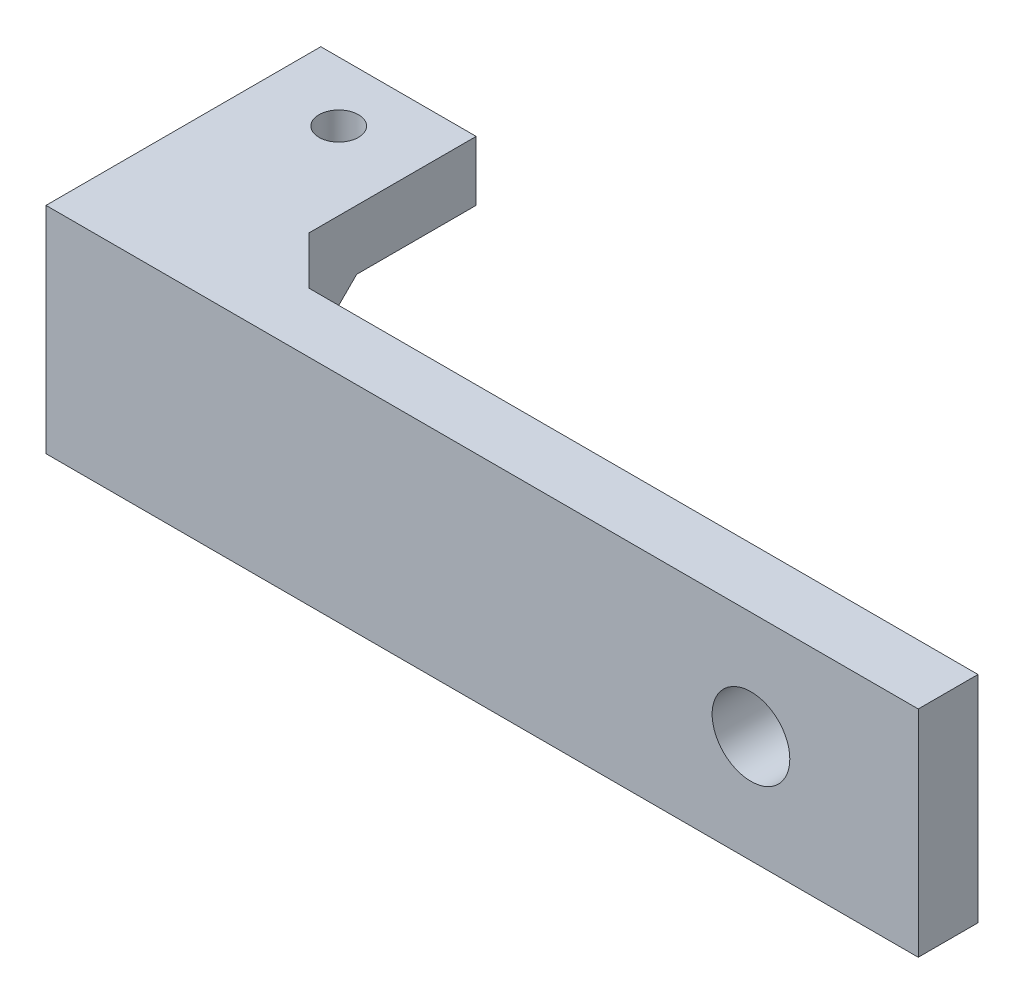
ISO-10303-21;
HEADER;
FILE_DESCRIPTION(('STEP AP214'),'2;1');
FILE_NAME('part.step','',(''),(''),'','','');
FILE_SCHEMA(('AUTOMOTIVE_DESIGN { 1 0 10303 214 1 1 1 1 }'));
ENDSEC;
DATA;
#1=APPLICATION_CONTEXT('core data for automotive mechanical design processes');
#2=APPLICATION_PROTOCOL_DEFINITION('international standard','automotive_design',2000,#1);
#3=PRODUCT_CONTEXT('',#1,'mechanical');
#4=PRODUCT('Part','Part','',(#3));
#5=PRODUCT_RELATED_PRODUCT_CATEGORY('part','',(#4));
#6=PRODUCT_DEFINITION_FORMATION('','',#4);
#7=PRODUCT_DEFINITION_CONTEXT('part definition',#1,'design');
#8=PRODUCT_DEFINITION('design','',#6,#7);
#9=PRODUCT_DEFINITION_SHAPE('','',#8);
#10=(LENGTH_UNIT() NAMED_UNIT(*) SI_UNIT(.MILLI.,.METRE.));
#11=(NAMED_UNIT(*) PLANE_ANGLE_UNIT() SI_UNIT($,.RADIAN.));
#12=(NAMED_UNIT(*) SI_UNIT($,.STERADIAN.) SOLID_ANGLE_UNIT());
#13=UNCERTAINTY_MEASURE_WITH_UNIT(LENGTH_MEASURE(1.E-05),#10,'distance_accuracy_value','');
#14=(GEOMETRIC_REPRESENTATION_CONTEXT(3) GLOBAL_UNCERTAINTY_ASSIGNED_CONTEXT((#13)) GLOBAL_UNIT_ASSIGNED_CONTEXT((#10,
#11,#12)) REPRESENTATION_CONTEXT('',''));
#15=CARTESIAN_POINT('',(0.,0.,0.));
#16=DIRECTION('',(0.,0.,1.));
#17=DIRECTION('',(1.,0.,0.));
#18=AXIS2_PLACEMENT_3D('',#15,#16,#17);
#19=CARTESIAN_POINT('',(0.,0.,5.));
#20=DIRECTION('',(-1.,0.,0.));
#21=DIRECTION('',(0.,0.,1.));
#22=AXIS2_PLACEMENT_3D('',#19,#20,#21);
#23=PLANE('',#22);
#24=DIRECTION('',(0.,1.,0.));
#25=VECTOR('',#24,1.);
#26=CARTESIAN_POINT('',(0.,0.,0.));
#27=LINE('',#26,#25);
#28=CARTESIAN_POINT('',(0.,1.84930437196819,0.));
#29=VERTEX_POINT('',#28);
#30=CARTESIAN_POINT('',(0.,19.8493043719682,0.));
#31=VERTEX_POINT('',#30);
#32=EDGE_CURVE('E154',#29,#31,#27,.T.);
#33=ORIENTED_EDGE('',*,*,#32,.T.);
#34=DIRECTION('',(0.,0.,-1.));
#35=VECTOR('',#34,1.);
#36=CARTESIAN_POINT('',(0.,19.8493043719682,5.));
#37=LINE('',#36,#35);
#38=CARTESIAN_POINT('',(0.,19.8493043719682,5.));
#39=VERTEX_POINT('',#38);
#40=EDGE_CURVE('E163',#39,#31,#37,.T.);
#41=ORIENTED_EDGE('',*,*,#40,.F.);
#42=DIRECTION('',(0.,1.,0.));
#43=VECTOR('',#42,1.);
#44=CARTESIAN_POINT('',(0.,0.,5.));
#45=LINE('',#44,#43);
#46=CARTESIAN_POINT('',(0.,1.84930437196819,5.));
#47=VERTEX_POINT('',#46);
#48=EDGE_CURVE('E143',#47,#39,#45,.T.);
#49=ORIENTED_EDGE('',*,*,#48,.F.);
#50=DIRECTION('',(0.,0.,-1.));
#51=VECTOR('',#50,1.);
#52=CARTESIAN_POINT('',(0.,1.84930437196819,5.));
#53=LINE('',#52,#51);
#54=EDGE_CURVE('E150',#47,#29,#53,.T.);
#55=ORIENTED_EDGE('',*,*,#54,.T.);
#56=EDGE_LOOP('',(#33,#41,#49,#55));
#57=FACE_BOUND('',#56,.T.);
#58=ADVANCED_FACE('F35',(#57),#23,.F.);
#59=CARTESIAN_POINT('',(0.,19.8493043719682,5.));
#60=DIRECTION('',(0.,-1.,0.));
#61=DIRECTION('',(1.,0.,0.));
#62=AXIS2_PLACEMENT_3D('',#59,#60,#61);
#63=PLANE('',#62);
#64=CARTESIAN_POINT('',(-66.5,19.8493043719682,-13.));
#65=DIRECTION('',(0.,-1.,0.));
#66=DIRECTION('',(1.,0.,0.));
#67=AXIS2_PLACEMENT_3D('',#64,#65,#66);
#68=CIRCLE('',#67,1.65);
#69=CARTESIAN_POINT('',(-64.85,19.8493043719682,-13.));
#70=VERTEX_POINT('',#69);
#71=EDGE_CURVE('E123',#70,#70,#68,.T.);
#72=ORIENTED_EDGE('',*,*,#71,.T.);
#73=EDGE_LOOP('',(#72));
#74=FACE_BOUND('',#73,.T.);
#75=DIRECTION('',(-1.,0.,0.));
#76=VECTOR('',#75,1.);
#77=CARTESIAN_POINT('',(0.,19.8493043719682,0.));
#78=LINE('',#77,#76);
#79=CARTESIAN_POINT('',(-56.,19.8493043719682,0.));
#80=VERTEX_POINT('',#79);
#81=EDGE_CURVE('E158',#31,#80,#78,.T.);
#82=ORIENTED_EDGE('',*,*,#81,.T.);
#83=DIRECTION('',(-0.707106781186544,0.,-0.707106781186551));
#84=VECTOR('',#83,1.);
#85=CARTESIAN_POINT('',(-25.5000000000003,19.8493043719682,30.5));
#86=LINE('',#85,#84);
#87=CARTESIAN_POINT('',(-60.,19.8493043719682,-4.00000000000004));
#88=VERTEX_POINT('',#87);
#89=EDGE_CURVE('E43',#80,#88,#86,.T.);
#90=ORIENTED_EDGE('',*,*,#89,.T.);
#91=DIRECTION('',(0.,0.,-1.));
#92=VECTOR('',#91,1.);
#93=CARTESIAN_POINT('',(-60.,19.8493043719682,27.2036033111745));
#94=LINE('',#93,#92);
#95=CARTESIAN_POINT('',(-60.,19.8493043719682,-18.));
#96=VERTEX_POINT('',#95);
#97=EDGE_CURVE('E155',#88,#96,#94,.T.);
#98=ORIENTED_EDGE('',*,*,#97,.T.);
#99=DIRECTION('',(-1.,0.,0.));
#100=VECTOR('',#99,1.);
#101=CARTESIAN_POINT('',(-46.0716117228159,19.8493043719682,-18.));
#102=LINE('',#101,#100);
#103=CARTESIAN_POINT('',(-73.,19.8493043719682,-18.));
#104=VERTEX_POINT('',#103);
#105=EDGE_CURVE('E234',#96,#104,#102,.T.);
#106=ORIENTED_EDGE('',*,*,#105,.T.);
#107=DIRECTION('',(0.,0.,-1.));
#108=VECTOR('',#107,1.);
#109=CARTESIAN_POINT('',(-73.,19.8493043719682,27.2036033111745));
#110=LINE('',#109,#108);
#111=CARTESIAN_POINT('',(-73.,19.8493043719682,5.));
#112=VERTEX_POINT('',#111);
#113=EDGE_CURVE('E132',#112,#104,#110,.T.);
#114=ORIENTED_EDGE('',*,*,#113,.F.);
#115=DIRECTION('',(-1.,0.,0.));
#116=VECTOR('',#115,1.);
#117=CARTESIAN_POINT('',(0.,19.8493043719682,5.));
#118=LINE('',#117,#116);
#119=EDGE_CURVE('E147',#39,#112,#118,.T.);
#120=ORIENTED_EDGE('',*,*,#119,.F.);
#121=ORIENTED_EDGE('',*,*,#40,.T.);
#122=EDGE_LOOP('',(#82,#90,#98,#106,#114,#120,#121));
#123=FACE_BOUND('',#122,.T.);
#124=ADVANCED_FACE('F180',(#74,#123),#63,.F.);
#125=CARTESIAN_POINT('',(-14.,10.8493043719682,5.));
#126=DIRECTION('',(0.,0.,-1.));
#127=DIRECTION('',(-1.,0.,0.));
#128=AXIS2_PLACEMENT_3D('',#125,#126,#127);
#129=CYLINDRICAL_SURFACE('',#128,3.25);
#130=CARTESIAN_POINT('',(-14.,10.8493043719682,5.));
#131=DIRECTION('',(0.,0.,1.));
#132=DIRECTION('',(1.,0.,0.));
#133=AXIS2_PLACEMENT_3D('',#130,#131,#132);
#134=CIRCLE('',#133,3.25);
#135=CARTESIAN_POINT('',(-10.75,10.8493043719682,5.));
#136=VERTEX_POINT('',#135);
#137=EDGE_CURVE('E140',#136,#136,#134,.T.);
#138=ORIENTED_EDGE('',*,*,#137,.T.);
#139=EDGE_LOOP('',(#138));
#140=FACE_BOUND('',#139,.T.);
#141=CARTESIAN_POINT('',(-14.,10.8493043719682,0.));
#142=DIRECTION('',(0.,0.,1.));
#143=DIRECTION('',(1.,0.,0.));
#144=AXIS2_PLACEMENT_3D('',#141,#142,#143);
#145=CIRCLE('',#144,3.25);
#146=CARTESIAN_POINT('',(-10.75,10.8493043719682,0.));
#147=VERTEX_POINT('',#146);
#148=EDGE_CURVE('E151',#147,#147,#145,.T.);
#149=ORIENTED_EDGE('',*,*,#148,.F.);
#150=EDGE_LOOP('',(#149));
#151=FACE_BOUND('',#150,.T.);
#152=ADVANCED_FACE('F207',(#140,#151),#129,.F.);
#153=CARTESIAN_POINT('',(0.,1.84930437196819,5.));
#154=DIRECTION('',(0.,1.,0.));
#155=DIRECTION('',(0.,0.,1.));
#156=AXIS2_PLACEMENT_3D('',#153,#154,#155);
#157=PLANE('',#156);
#158=DIRECTION('',(0.,0.,-1.));
#159=VECTOR('',#158,1.);
#160=CARTESIAN_POINT('',(-73.,1.84930437196819,27.2036033111745));
#161=LINE('',#160,#159);
#162=CARTESIAN_POINT('',(-73.,1.84930437196819,5.));
#163=VERTEX_POINT('',#162);
#164=CARTESIAN_POINT('',(-73.,1.84930437196819,0.));
#165=VERTEX_POINT('',#164);
#166=EDGE_CURVE('E119',#163,#165,#161,.T.);
#167=ORIENTED_EDGE('',*,*,#166,.T.);
#168=DIRECTION('',(-1.,0.,0.));
#169=VECTOR('',#168,1.);
#170=CARTESIAN_POINT('',(-50.,1.84930437196819,0.));
#171=LINE('',#170,#169);
#172=CARTESIAN_POINT('',(-56.,1.84930437196819,0.));
#173=VERTEX_POINT('',#172);
#174=EDGE_CURVE('E107',#173,#165,#171,.T.);
#175=ORIENTED_EDGE('',*,*,#174,.F.);
#176=DIRECTION('',(1.,0.,0.));
#177=VECTOR('',#176,1.);
#178=CARTESIAN_POINT('',(0.,1.84930437196819,0.));
#179=LINE('',#178,#177);
#180=EDGE_CURVE('E144',#173,#29,#179,.T.);
#181=ORIENTED_EDGE('',*,*,#180,.T.);
#182=ORIENTED_EDGE('',*,*,#54,.F.);
#183=DIRECTION('',(1.,0.,0.));
#184=VECTOR('',#183,1.);
#185=CARTESIAN_POINT('',(0.,1.84930437196819,5.));
#186=LINE('',#185,#184);
#187=EDGE_CURVE('E127',#163,#47,#186,.T.);
#188=ORIENTED_EDGE('',*,*,#187,.F.);
#189=EDGE_LOOP('',(#167,#175,#181,#182,#188));
#190=FACE_BOUND('',#189,.T.);
#191=ADVANCED_FACE('F125',(#190),#157,.F.);
#192=CARTESIAN_POINT('',(0.,0.,5.));
#193=DIRECTION('',(0.,0.,1.));
#194=DIRECTION('',(1.,0.,0.));
#195=AXIS2_PLACEMENT_3D('',#192,#193,#194);
#196=PLANE('',#195);
#197=ORIENTED_EDGE('',*,*,#137,.F.);
#198=EDGE_LOOP('',(#197));
#199=FACE_BOUND('',#198,.T.);
#200=ORIENTED_EDGE('',*,*,#48,.T.);
#201=ORIENTED_EDGE('',*,*,#119,.T.);
#202=DIRECTION('',(0.,1.,0.));
#203=VECTOR('',#202,1.);
#204=CARTESIAN_POINT('',(-73.,19.8493043719682,5.));
#205=LINE('',#204,#203);
#206=EDGE_CURVE('E129',#163,#112,#205,.T.);
#207=ORIENTED_EDGE('',*,*,#206,.F.);
#208=ORIENTED_EDGE('',*,*,#187,.T.);
#209=EDGE_LOOP('',(#200,#201,#207,#208));
#210=FACE_BOUND('',#209,.T.);
#211=ADVANCED_FACE('F217',(#199,#210),#196,.T.);
#212=CARTESIAN_POINT('',(0.,0.,0.));
#213=DIRECTION('',(0.,0.,1.));
#214=DIRECTION('',(1.,0.,0.));
#215=AXIS2_PLACEMENT_3D('',#212,#213,#214);
#216=PLANE('',#215);
#217=ORIENTED_EDGE('',*,*,#148,.T.);
#218=EDGE_LOOP('',(#217));
#219=FACE_BOUND('',#218,.T.);
#220=ORIENTED_EDGE('',*,*,#180,.F.);
#221=DIRECTION('',(0.,1.,0.));
#222=VECTOR('',#221,1.);
#223=CARTESIAN_POINT('',(-56.,0.,0.));
#224=LINE('',#223,#222);
#225=EDGE_CURVE('E57',#173,#80,#224,.T.);
#226=ORIENTED_EDGE('',*,*,#225,.T.);
#227=ORIENTED_EDGE('',*,*,#81,.F.);
#228=ORIENTED_EDGE('',*,*,#32,.F.);
#229=EDGE_LOOP('',(#220,#226,#227,#228));
#230=FACE_BOUND('',#229,.T.);
#231=ADVANCED_FACE('F222',(#219,#230),#216,.F.);
#232=CARTESIAN_POINT('',(-73.,19.8493043719682,27.2036033111745));
#233=DIRECTION('',(-1.,0.,0.));
#234=DIRECTION('',(0.,0.,1.));
#235=AXIS2_PLACEMENT_3D('',#232,#233,#234);
#236=PLANE('',#235);
#237=DIRECTION('',(0.,0.894427190999916,-0.447213595499958));
#238=VECTOR('',#237,1.);
#239=CARTESIAN_POINT('',(-73.,11.8493043719682,-5.));
#240=LINE('',#239,#238);
#241=CARTESIAN_POINT('',(-73.,11.8493043719682,-5.));
#242=VERTEX_POINT('',#241);
#243=EDGE_CURVE('E110',#165,#242,#240,.T.);
#244=ORIENTED_EDGE('',*,*,#243,.F.);
#245=ORIENTED_EDGE('',*,*,#166,.F.);
#246=ORIENTED_EDGE('',*,*,#206,.T.);
#247=ORIENTED_EDGE('',*,*,#113,.T.);
#248=DIRECTION('',(0.,-1.,0.));
#249=VECTOR('',#248,1.);
#250=CARTESIAN_POINT('',(-73.,19.8493043719682,-18.));
#251=LINE('',#250,#249);
#252=CARTESIAN_POINT('',(-73.,14.8493043719682,-18.));
#253=VERTEX_POINT('',#252);
#254=EDGE_CURVE('E232',#104,#253,#251,.T.);
#255=ORIENTED_EDGE('',*,*,#254,.T.);
#256=DIRECTION('',(0.,0.,1.));
#257=VECTOR('',#256,1.);
#258=CARTESIAN_POINT('',(-73.,14.8493043719682,-18.));
#259=LINE('',#258,#257);
#260=CARTESIAN_POINT('',(-73.,14.8493043719682,-8.00000000000002));
#261=VERTEX_POINT('',#260);
#262=EDGE_CURVE('E236',#253,#261,#259,.T.);
#263=ORIENTED_EDGE('',*,*,#262,.T.);
#264=DIRECTION('',(0.,-0.707106781186544,0.707106781186551));
#265=VECTOR('',#264,1.);
#266=CARTESIAN_POINT('',(-73.,14.8493043719682,-8.00000000000002));
#267=LINE('',#266,#265);
#268=EDGE_CURVE('E121',#261,#242,#267,.T.);
#269=ORIENTED_EDGE('',*,*,#268,.T.);
#270=EDGE_LOOP('',(#244,#245,#246,#247,#255,#263,#269));
#271=FACE_BOUND('',#270,.T.);
#272=ADVANCED_FACE('F117',(#271),#236,.T.);
#273=CARTESIAN_POINT('',(-60.,19.8493043719682,27.2036033111745));
#274=DIRECTION('',(1.,0.,0.));
#275=DIRECTION('',(0.,0.,-1.));
#276=AXIS2_PLACEMENT_3D('',#273,#274,#275);
#277=PLANE('',#276);
#278=DIRECTION('',(0.,-0.894427190999916,0.447213595499958));
#279=VECTOR('',#278,1.);
#280=CARTESIAN_POINT('',(-60.,5.36786304749839,-1.7592793377651));
#281=LINE('',#280,#279);
#282=CARTESIAN_POINT('',(-60.,11.8493043719682,-5.));
#283=VERTEX_POINT('',#282);
#284=CARTESIAN_POINT('',(-60.,9.84930437196827,-4.00000000000004));
#285=VERTEX_POINT('',#284);
#286=EDGE_CURVE('E50',#283,#285,#281,.T.);
#287=ORIENTED_EDGE('',*,*,#286,.F.);
#288=DIRECTION('',(0.,0.707106781186544,-0.707106781186551));
#289=VECTOR('',#288,1.);
#290=CARTESIAN_POINT('',(-60.,14.8493043719682,-8.00000000000002));
#291=LINE('',#290,#289);
#292=CARTESIAN_POINT('',(-60.,14.8493043719682,-8.00000000000002));
#293=VERTEX_POINT('',#292);
#294=EDGE_CURVE('E172',#283,#293,#291,.T.);
#295=ORIENTED_EDGE('',*,*,#294,.T.);
#296=DIRECTION('',(0.,0.,1.));
#297=VECTOR('',#296,1.);
#298=CARTESIAN_POINT('',(-60.,14.8493043719682,-18.));
#299=LINE('',#298,#297);
#300=CARTESIAN_POINT('',(-60.,14.8493043719682,-18.));
#301=VERTEX_POINT('',#300);
#302=EDGE_CURVE('E130',#301,#293,#299,.T.);
#303=ORIENTED_EDGE('',*,*,#302,.F.);
#304=DIRECTION('',(0.,-1.,0.));
#305=VECTOR('',#304,1.);
#306=CARTESIAN_POINT('',(-60.,19.8493043719682,-18.));
#307=LINE('',#306,#305);
#308=EDGE_CURVE('E188',#96,#301,#307,.T.);
#309=ORIENTED_EDGE('',*,*,#308,.F.);
#310=ORIENTED_EDGE('',*,*,#97,.F.);
#311=DIRECTION('',(0.,-1.,0.));
#312=VECTOR('',#311,1.);
#313=CARTESIAN_POINT('',(-60.,19.8493043719682,-4.00000000000004));
#314=LINE('',#313,#312);
#315=EDGE_CURVE('E174',#88,#285,#314,.T.);
#316=ORIENTED_EDGE('',*,*,#315,.T.);
#317=EDGE_LOOP('',(#287,#295,#303,#309,#310,#316));
#318=FACE_BOUND('',#317,.T.);
#319=ADVANCED_FACE('F186',(#318),#277,.T.);
#320=CARTESIAN_POINT('',(-46.0716117228159,19.8493043719682,-18.));
#321=DIRECTION('',(0.,0.,-1.));
#322=DIRECTION('',(-1.,0.,0.));
#323=AXIS2_PLACEMENT_3D('',#320,#321,#322);
#324=PLANE('',#323);
#325=ORIENTED_EDGE('',*,*,#105,.F.);
#326=ORIENTED_EDGE('',*,*,#308,.T.);
#327=DIRECTION('',(-1.,0.,0.));
#328=VECTOR('',#327,1.);
#329=CARTESIAN_POINT('',(-46.0716117228159,14.8493043719682,-18.));
#330=LINE('',#329,#328);
#331=EDGE_CURVE('E135',#301,#253,#330,.T.);
#332=ORIENTED_EDGE('',*,*,#331,.T.);
#333=ORIENTED_EDGE('',*,*,#254,.F.);
#334=EDGE_LOOP('',(#325,#326,#332,#333));
#335=FACE_BOUND('',#334,.T.);
#336=ADVANCED_FACE('F238',(#335),#324,.T.);
#337=CARTESIAN_POINT('',(-46.0716117228159,14.8493043719682,-18.));
#338=DIRECTION('',(0.,-1.,0.));
#339=DIRECTION('',(0.,0.,-1.));
#340=AXIS2_PLACEMENT_3D('',#337,#338,#339);
#341=PLANE('',#340);
#342=CARTESIAN_POINT('',(-66.5,14.8493043719682,-13.));
#343=DIRECTION('',(0.,-1.,0.));
#344=DIRECTION('',(0.,0.,-1.));
#345=AXIS2_PLACEMENT_3D('',#342,#343,#344);
#346=CIRCLE('',#345,1.65);
#347=CARTESIAN_POINT('',(-66.5,14.8493043719682,-14.65));
#348=VERTEX_POINT('',#347);
#349=EDGE_CURVE('E248',#348,#348,#346,.T.);
#350=ORIENTED_EDGE('',*,*,#349,.F.);
#351=EDGE_LOOP('',(#350));
#352=FACE_BOUND('',#351,.T.);
#353=ORIENTED_EDGE('',*,*,#302,.T.);
#354=DIRECTION('',(-1.,0.,0.));
#355=VECTOR('',#354,1.);
#356=CARTESIAN_POINT('',(-46.0716117228159,14.8493043719682,-8.00000000000002));
#357=LINE('',#356,#355);
#358=EDGE_CURVE('E166',#293,#261,#357,.T.);
#359=ORIENTED_EDGE('',*,*,#358,.T.);
#360=ORIENTED_EDGE('',*,*,#262,.F.);
#361=ORIENTED_EDGE('',*,*,#331,.F.);
#362=EDGE_LOOP('',(#353,#359,#360,#361));
#363=FACE_BOUND('',#362,.T.);
#364=ADVANCED_FACE('F198',(#352,#363),#341,.T.);
#365=CARTESIAN_POINT('',(-46.0716117228159,14.8493043719682,-8.00000000000002));
#366=DIRECTION('',(0.,0.707106781186551,0.707106781186544));
#367=DIRECTION('',(-1.,0.,0.));
#368=AXIS2_PLACEMENT_3D('',#365,#366,#367);
#369=PLANE('',#368);
#370=ORIENTED_EDGE('',*,*,#294,.F.);
#371=DIRECTION('',(1.,0.,0.));
#372=VECTOR('',#371,1.);
#373=CARTESIAN_POINT('',(0.,11.8493043719682,-5.));
#374=LINE('',#373,#372);
#375=EDGE_CURVE('E169',#242,#283,#374,.T.);
#376=ORIENTED_EDGE('',*,*,#375,.F.);
#377=ORIENTED_EDGE('',*,*,#268,.F.);
#378=ORIENTED_EDGE('',*,*,#358,.F.);
#379=EDGE_LOOP('',(#370,#376,#377,#378));
#380=FACE_BOUND('',#379,.T.);
#381=ADVANCED_FACE('F191',(#380),#369,.F.);
#382=CARTESIAN_POINT('',(-60.,19.8493043719682,-4.00000000000004));
#383=DIRECTION('',(-0.707106781186551,0.,0.707106781186544));
#384=DIRECTION('',(0.,-1.,0.));
#385=AXIS2_PLACEMENT_3D('',#382,#383,#384);
#386=PLANE('',#385);
#387=ORIENTED_EDGE('',*,*,#225,.F.);
#388=DIRECTION('',(-0.408248290463859,0.816496580927727,-0.408248290463864));
#389=VECTOR('',#388,1.);
#390=CARTESIAN_POINT('',(-63.3333333333333,16.5159710386349,-7.33333333333335));
#391=LINE('',#390,#389);
#392=EDGE_CURVE('E11',#173,#285,#391,.T.);
#393=ORIENTED_EDGE('',*,*,#392,.T.);
#394=ORIENTED_EDGE('',*,*,#315,.F.);
#395=ORIENTED_EDGE('',*,*,#89,.F.);
#396=EDGE_LOOP('',(#387,#393,#394,#395));
#397=FACE_BOUND('',#396,.T.);
#398=ADVANCED_FACE('F37',(#397),#386,.F.);
#399=CARTESIAN_POINT('',(-50.,11.8493043719682,-5.));
#400=DIRECTION('',(0.,0.447213595499958,0.894427190999916));
#401=DIRECTION('',(0.,-0.894427190999916,0.447213595499958));
#402=AXIS2_PLACEMENT_3D('',#399,#400,#401);
#403=PLANE('',#402);
#404=ORIENTED_EDGE('',*,*,#286,.T.);
#405=ORIENTED_EDGE('',*,*,#392,.F.);
#406=ORIENTED_EDGE('',*,*,#174,.T.);
#407=ORIENTED_EDGE('',*,*,#243,.T.);
#408=ORIENTED_EDGE('',*,*,#375,.T.);
#409=EDGE_LOOP('',(#404,#405,#406,#407,#408));
#410=FACE_BOUND('',#409,.T.);
#411=ADVANCED_FACE('F109',(#410),#403,.F.);
#412=CARTESIAN_POINT('',(-66.5,24.8493043719682,-13.));
#413=DIRECTION('',(0.,-1.,0.));
#414=DIRECTION('',(0.,0.,-1.));
#415=AXIS2_PLACEMENT_3D('',#412,#413,#414);
#416=CYLINDRICAL_SURFACE('',#415,1.65);
#417=ORIENTED_EDGE('',*,*,#349,.T.);
#418=EDGE_LOOP('',(#417));
#419=FACE_BOUND('',#418,.T.);
#420=ORIENTED_EDGE('',*,*,#71,.F.);
#421=EDGE_LOOP('',(#420));
#422=FACE_BOUND('',#421,.T.);
#423=ADVANCED_FACE('F196',(#419,#422),#416,.F.);
#424=CLOSED_SHELL('',(#58,#124,#152,#191,#211,#231,#272,#319,#336,#364,#381,#398,#411,#423));
#425=MANIFOLD_SOLID_BREP('B2',#424);
#426=ADVANCED_BREP_SHAPE_REPRESENTATION('',(#18,#425),#14);
#427=SHAPE_DEFINITION_REPRESENTATION(#9,#426);
ENDSEC;
END-ISO-10303-21;
